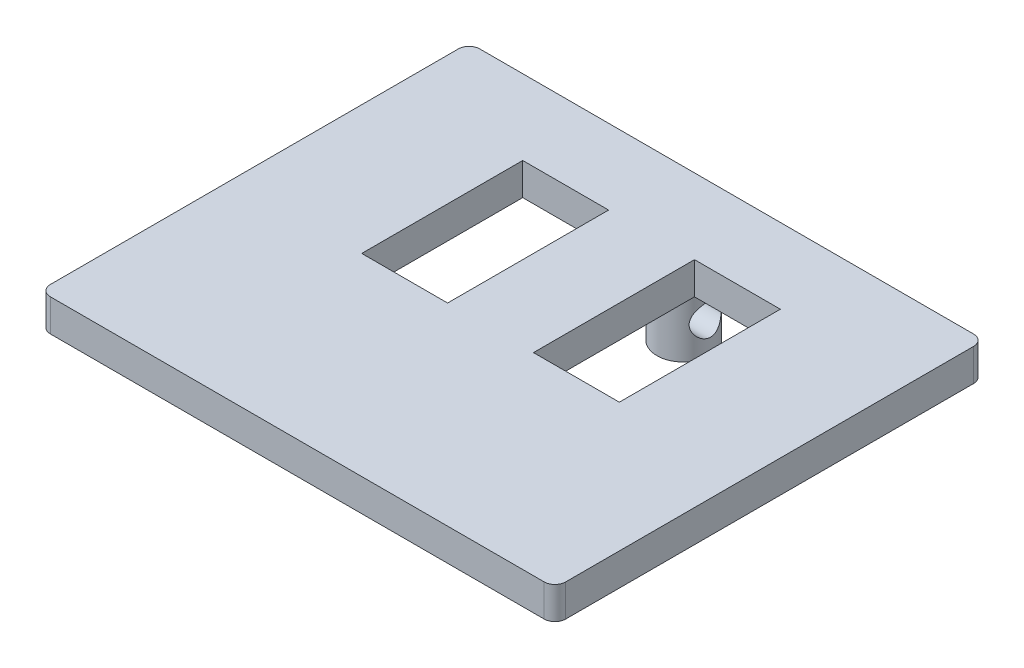
ISO-10303-21;
HEADER;
FILE_DESCRIPTION(('STEP AP214'),'2;1');
FILE_NAME('part.step','',(''),(''),'','','');
FILE_SCHEMA(('AUTOMOTIVE_DESIGN { 1 0 10303 214 1 1 1 1 }'));
ENDSEC;
DATA;
#1=APPLICATION_CONTEXT('core data for automotive mechanical design processes');
#2=APPLICATION_PROTOCOL_DEFINITION('international standard','automotive_design',2000,#1);
#3=PRODUCT_CONTEXT('',#1,'mechanical');
#4=PRODUCT('Part','Part','',(#3));
#5=PRODUCT_RELATED_PRODUCT_CATEGORY('part','',(#4));
#6=PRODUCT_DEFINITION_FORMATION('','',#4);
#7=PRODUCT_DEFINITION_CONTEXT('part definition',#1,'design');
#8=PRODUCT_DEFINITION('design','',#6,#7);
#9=PRODUCT_DEFINITION_SHAPE('','',#8);
#10=(LENGTH_UNIT() NAMED_UNIT(*) SI_UNIT(.MILLI.,.METRE.));
#11=(NAMED_UNIT(*) PLANE_ANGLE_UNIT() SI_UNIT($,.RADIAN.));
#12=(NAMED_UNIT(*) SI_UNIT($,.STERADIAN.) SOLID_ANGLE_UNIT());
#13=UNCERTAINTY_MEASURE_WITH_UNIT(LENGTH_MEASURE(1.E-05),#10,'distance_accuracy_value','');
#14=(GEOMETRIC_REPRESENTATION_CONTEXT(3) GLOBAL_UNCERTAINTY_ASSIGNED_CONTEXT((#13)) GLOBAL_UNIT_ASSIGNED_CONTEXT((#10,
#11,#12)) REPRESENTATION_CONTEXT('',''));
#15=CARTESIAN_POINT('',(0.,0.,0.));
#16=DIRECTION('',(0.,0.,1.));
#17=DIRECTION('',(1.,0.,0.));
#18=AXIS2_PLACEMENT_3D('',#15,#16,#17);
#19=CARTESIAN_POINT('',(0.,-7.,-16.));
#20=DIRECTION('',(0.,1.,0.));
#21=DIRECTION('',(0.,0.,1.));
#22=AXIS2_PLACEMENT_3D('',#19,#20,#21);
#23=CYLINDRICAL_SURFACE('',#22,2.5);
#24=CARTESIAN_POINT('',(2.,-4.,-17.5));
#25=CARTESIAN_POINT('',(1.99999416642512,-3.92452102471036,-17.5000040410859));
#26=CARTESIAN_POINT('',(2.00433633903481,-3.84906156592021,-17.4942685282401));
#27=CARTESIAN_POINT('',(2.02092590613883,-3.70067609603779,-17.4717496515279));
#28=CARTESIAN_POINT('',(2.03318155043097,-3.6277528126149,-17.4549547578894));
#29=CARTESIAN_POINT('',(2.0636233903473,-3.48691635832272,-17.4114348633579));
#30=CARTESIAN_POINT('',(2.0817666618312,-3.41897116196474,-17.3847815450315));
#31=CARTESIAN_POINT('',(2.12185904995836,-3.28856254663208,-17.3225290928302));
#32=CARTESIAN_POINT('',(2.14380930122416,-3.22610077030486,-17.2869272905469));
#33=CARTESIAN_POINT('',(2.19228594587542,-3.10005098333592,-17.2027129274764));
#34=CARTESIAN_POINT('',(2.21904371037662,-3.03725904287606,-17.1530417943529));
#35=CARTESIAN_POINT('',(2.27226229431061,-2.92023523725825,-17.0442680130998));
#36=CARTESIAN_POINT('',(2.29872287517103,-2.8660098483292,-16.9851582967296));
#37=CARTESIAN_POINT('',(2.35175567858734,-2.76186619029031,-16.8514423674117));
#38=CARTESIAN_POINT('',(2.37803133577818,-2.71304553633025,-16.7758519951625));
#39=CARTESIAN_POINT('',(2.42443786983179,-2.62919027755557,-16.6156542282717));
#40=CARTESIAN_POINT('',(2.44457437988735,-2.59414302587729,-16.5310551966263));
#41=CARTESIAN_POINT('',(2.4747098780044,-2.54240407718736,-16.3637714067427));
#42=CARTESIAN_POINT('',(2.4854930393917,-2.52427963903271,-16.2816746981309));
#43=CARTESIAN_POINT('',(2.49874939277545,-2.50205719713688,-16.1149705093827));
#44=CARTESIAN_POINT('',(2.50123038813308,-2.49794602199995,-16.0303654624002));
#45=CARTESIAN_POINT('',(2.49783372711539,-2.50361374734246,-15.8723627162627));
#46=CARTESIAN_POINT('',(2.49295437513726,-2.51173352616932,-15.7988761671344));
#47=CARTESIAN_POINT('',(2.47707997553857,-2.53847979564811,-15.6545357308482));
#48=CARTESIAN_POINT('',(2.46608447529309,-2.55710706390716,-15.5836820389488));
#49=CARTESIAN_POINT('',(2.4388490720172,-2.60416556270378,-15.4459432195309));
#50=CARTESIAN_POINT('',(2.42257910450824,-2.632653061139,-15.3790835089624));
#51=CARTESIAN_POINT('',(2.38609637638748,-2.69838461622555,-15.2510113398844));
#52=CARTESIAN_POINT('',(2.36588259201812,-2.73563094705901,-15.189800353792));
#53=CARTESIAN_POINT('',(2.32037925976363,-2.82283909280445,-15.0669257328568));
#54=CARTESIAN_POINT('',(2.2947718295215,-2.87378831173574,-15.0060813368018));
#55=CARTESIAN_POINT('',(2.24255554245601,-2.98440411786018,-14.8932853409073));
#56=CARTESIAN_POINT('',(2.21594536703376,-3.04408250347451,-14.8413459869166));
#57=CARTESIAN_POINT('',(2.16111075123946,-3.17865340616356,-14.7417516223258));
#58=CARTESIAN_POINT('',(2.13305661385125,-3.25450757653946,-14.6952906681137));
#59=CARTESIAN_POINT('',(2.08250879557268,-3.41470623163661,-14.6160278280577));
#60=CARTESIAN_POINT('',(2.06000490298821,-3.49903471612564,-14.5832007803781));
#61=CARTESIAN_POINT('',(2.02895865196732,-3.65239363189535,-14.5392250293516));
#62=CARTESIAN_POINT('',(2.01833888618316,-3.72004063229665,-14.5247209668733));
#63=CARTESIAN_POINT('',(2.00392150777559,-3.85737361029949,-14.5051912724472));
#64=CARTESIAN_POINT('',(2.00011596115117,-3.92705712048457,-14.5001546169709));
#65=CARTESIAN_POINT('',(1.99988914321324,-4.06655168243571,-14.4998521888582));
#66=CARTESIAN_POINT('',(2.00347810223985,-4.13636277721521,-14.5045999530234));
#67=CARTESIAN_POINT('',(2.01751520788653,-4.27398734374856,-14.5235970942506));
#68=CARTESIAN_POINT('',(2.02796877613214,-4.34179919224026,-14.5378539816986));
#69=CARTESIAN_POINT('',(2.05431768333101,-4.47371457947979,-14.5751168738134));
#70=CARTESIAN_POINT('',(2.07020622092813,-4.53782263653223,-14.5981119474264));
#71=CARTESIAN_POINT('',(2.10571539417588,-4.66147771573018,-14.6520373894293));
#72=CARTESIAN_POINT('',(2.12533743689999,-4.72102300636601,-14.6829707511179));
#73=CARTESIAN_POINT('',(2.17036819177737,-4.84524008251225,-14.7583256044149));
#74=CARTESIAN_POINT('',(2.1961823939737,-4.90890083509657,-14.804173369397));
#75=CARTESIAN_POINT('',(2.24821754803621,-5.02828548484946,-14.905126044813));
#76=CARTESIAN_POINT('',(2.27443886711455,-5.08400169216912,-14.960239813276));
#77=CARTESIAN_POINT('',(2.32835625910914,-5.19322400735043,-15.0867251627872));
#78=CARTESIAN_POINT('',(2.3558007587587,-5.24550072660584,-15.1592788912198));
#79=CARTESIAN_POINT('',(2.40537639133459,-5.33690277683665,-15.313896899132));
#80=CARTESIAN_POINT('',(2.42751104449411,-5.37603682784092,-15.3959548238653));
#81=CARTESIAN_POINT('',(2.46252280092775,-5.43686820343136,-15.5611597670279));
#82=CARTESIAN_POINT('',(2.47595588067329,-5.4596262277911,-15.6437940363487));
#83=CARTESIAN_POINT('',(2.494407389061,-5.49071460284625,-15.8126169361091));
#84=CARTESIAN_POINT('',(2.49943534582737,-5.49906129071762,-15.898801428218));
#85=CARTESIAN_POINT('',(2.50040600461976,-5.50067460858592,-16.059812023201));
#86=CARTESIAN_POINT('',(2.49747057186327,-5.49580333456303,-16.1346205835897));
#87=CARTESIAN_POINT('',(2.48512948412096,-5.47510617561838,-16.2821487559788));
#88=CARTESIAN_POINT('',(2.47572375706639,-5.4592801686784,-16.3548683447019));
#89=CARTESIAN_POINT('',(2.45149427526962,-5.41778042841621,-16.4951454819788));
#90=CARTESIAN_POINT('',(2.43675966858906,-5.39226840387075,-16.5627670326088));
#91=CARTESIAN_POINT('',(2.40303337447155,-5.33235940544524,-16.692781972));
#92=CARTESIAN_POINT('',(2.38404073252268,-5.29796043914039,-16.7551741841998));
#93=CARTESIAN_POINT('',(2.3409343265938,-5.21707480343124,-16.8802636452959));
#94=CARTESIAN_POINT('',(2.31648844639149,-5.16968129098313,-16.9422586904399));
#95=CARTESIAN_POINT('',(2.26601907350661,-5.06624696628227,-17.0578975153631));
#96=CARTESIAN_POINT('',(2.23999385274509,-5.01019657439209,-17.1115319095692));
#97=CARTESIAN_POINT('',(2.18528165666204,-4.8827144378223,-17.2159097535057));
#98=CARTESIAN_POINT('',(2.15667566270901,-4.8102335138345,-17.2654240666337));
#99=CARTESIAN_POINT('',(2.10376464485145,-4.65651514723345,-17.3515681721032));
#100=CARTESIAN_POINT('',(2.07945738811052,-4.57528228601858,-17.3882046632266));
#101=CARTESIAN_POINT('',(2.0408000304796,-4.41293571486279,-17.4443711653513));
#102=CARTESIAN_POINT('',(2.02577665830138,-4.33240476403875,-17.4650952606019));
#103=CARTESIAN_POINT('',(2.00539032320036,-4.16790260529632,-17.4928926824043));
#104=CARTESIAN_POINT('',(2.00000648744643,-4.08393923424129,-17.4999955059584));
#105=CARTESIAN_POINT('',(2.,-4.,-17.5));
#106=B_SPLINE_CURVE_WITH_KNOTS('',3,(#24,#25,#26,#27,#28,#29,#30,#31,#32,#33,#34,#35,#36,#37,
#38,#39,#40,#41,#42,#43,#44,#45,#46,#47,#48,#49,#50,#51,#52,#53,#54,#55,#56,#57,#58,#59,#60,#61,
#62,#63,#64,#65,#66,#67,#68,#69,#70,#71,#72,#73,#74,#75,#76,#77,#78,#79,#80,#81,#82,#83,#84,#85,
#86,#87,#88,#89,#90,#91,#92,#93,#94,#95,#96,#97,#98,#99,#100,#101,#102,#103,#104,#105),
.UNSPECIFIED.,.T.,.F.,(4,2,2,2,2,2,2,2,2,2,2,2,2,2,2,2,2,2,2,2,2,2,2,2,2,2,2,2,2,2,2,2,2,2,2,2,
2,2,2,2,4),(0.,0.226085249493391,0.452406574330769,0.677113624991873,0.90188776221593,
1.15414462390001,1.40659128601843,1.68630157736223,1.96575443271219,2.21853330858497,
2.47107452602766,2.69230130543181,2.91354445887944,3.13607155036376,3.35865648368878,
3.60782810055848,3.85733966656907,4.13576671140275,4.41367760154767,4.62276298054683,
4.83160475643975,5.0407356601118,5.25003193304127,5.45906724365494,5.6681814915466,
5.91499438482001,6.16204457978453,6.44121828011587,6.72020638384846,6.97891479383336,
7.23732973022724,7.46129321849397,7.68525920139646,7.90563970188755,8.12606965394583,
8.37042963549485,8.61506198741953,8.89071695766602,9.16622832484803,9.41820120134352,
9.66962780912275),.UNSPECIFIED.);
#107=CARTESIAN_POINT('',(2.,-4.,-17.5));
#108=VERTEX_POINT('',#107);
#109=EDGE_CURVE('E273',#108,#108,#106,.T.);
#110=ORIENTED_EDGE('',*,*,#109,.F.);
#111=EDGE_LOOP('',(#110));
#112=FACE_BOUND('',#111,.T.);
#113=CARTESIAN_POINT('',(0.,-7.,-16.));
#114=DIRECTION('',(0.,-1.,0.));
#115=DIRECTION('',(0.,0.,-1.));
#116=AXIS2_PLACEMENT_3D('',#113,#114,#115);
#117=CIRCLE('',#116,2.5);
#118=CARTESIAN_POINT('',(0.,-7.,-18.5));
#119=VERTEX_POINT('',#118);
#120=EDGE_CURVE('E180',#119,#119,#117,.T.);
#121=ORIENTED_EDGE('',*,*,#120,.F.);
#122=EDGE_LOOP('',(#121));
#123=FACE_BOUND('',#122,.T.);
#124=CARTESIAN_POINT('',(0.,0.,-16.));
#125=DIRECTION('',(0.,-1.,0.));
#126=DIRECTION('',(0.,0.,-1.));
#127=AXIS2_PLACEMENT_3D('',#124,#125,#126);
#128=CIRCLE('',#127,2.5);
#129=CARTESIAN_POINT('',(0.,0.,-18.5));
#130=VERTEX_POINT('',#129);
#131=EDGE_CURVE('E309',#130,#130,#128,.T.);
#132=ORIENTED_EDGE('',*,*,#131,.T.);
#133=EDGE_LOOP('',(#132));
#134=FACE_BOUND('',#133,.T.);
#135=CARTESIAN_POINT('',(-2.,-4.,-17.5));
#136=CARTESIAN_POINT('',(-1.99999416642512,-4.07547897528964,-17.5000040410859));
#137=CARTESIAN_POINT('',(-2.00433633903481,-4.1509384340798,-17.4942685282401));
#138=CARTESIAN_POINT('',(-2.02092590613883,-4.29932390396222,-17.4717496515279));
#139=CARTESIAN_POINT('',(-2.03318155043097,-4.3722471873851,-17.4549547578894));
#140=CARTESIAN_POINT('',(-2.0636233903473,-4.51308364167728,-17.4114348633579));
#141=CARTESIAN_POINT('',(-2.0817666618312,-4.58102883803527,-17.3847815450315));
#142=CARTESIAN_POINT('',(-2.12185904995836,-4.71143745336792,-17.3225290928302));
#143=CARTESIAN_POINT('',(-2.14380930122416,-4.77389922969514,-17.2869272905469));
#144=CARTESIAN_POINT('',(-2.19228594587542,-4.89994901666408,-17.2027129274764));
#145=CARTESIAN_POINT('',(-2.21904371037662,-4.96274095712394,-17.1530417943529));
#146=CARTESIAN_POINT('',(-2.27226229431061,-5.07976476274175,-17.0442680130998));
#147=CARTESIAN_POINT('',(-2.29872287517103,-5.1339901516708,-16.9851582967296));
#148=CARTESIAN_POINT('',(-2.35175567858734,-5.23813380970969,-16.8514423674117));
#149=CARTESIAN_POINT('',(-2.37803133577818,-5.28695446366975,-16.7758519951625));
#150=CARTESIAN_POINT('',(-2.42443786983179,-5.37080972244443,-16.6156542282717));
#151=CARTESIAN_POINT('',(-2.44457437988735,-5.40585697412271,-16.5310551966263));
#152=CARTESIAN_POINT('',(-2.4747098780044,-5.45759592281264,-16.3637714067427));
#153=CARTESIAN_POINT('',(-2.4854930393917,-5.47572036096729,-16.2816746981309));
#154=CARTESIAN_POINT('',(-2.49874939277545,-5.49794280286312,-16.1149705093827));
#155=CARTESIAN_POINT('',(-2.50123038813308,-5.50205397800005,-16.0303654624002));
#156=CARTESIAN_POINT('',(-2.49783372711539,-5.49638625265754,-15.8723627162627));
#157=CARTESIAN_POINT('',(-2.49295437513726,-5.48826647383068,-15.7988761671344));
#158=CARTESIAN_POINT('',(-2.47707997553857,-5.46152020435189,-15.6545357308482));
#159=CARTESIAN_POINT('',(-2.46608447529309,-5.44289293609284,-15.5836820389488));
#160=CARTESIAN_POINT('',(-2.4388490720172,-5.39583443729622,-15.4459432195309));
#161=CARTESIAN_POINT('',(-2.42257910450824,-5.367346938861,-15.3790835089624));
#162=CARTESIAN_POINT('',(-2.38609637638748,-5.30161538377445,-15.2510113398844));
#163=CARTESIAN_POINT('',(-2.36588259201812,-5.26436905294098,-15.189800353792));
#164=CARTESIAN_POINT('',(-2.32037925976363,-5.17716090719555,-15.0669257328568));
#165=CARTESIAN_POINT('',(-2.2947718295215,-5.12621168826426,-15.0060813368018));
#166=CARTESIAN_POINT('',(-2.24255554245601,-5.01559588213982,-14.8932853409073));
#167=CARTESIAN_POINT('',(-2.21594536703375,-4.95591749652549,-14.8413459869166));
#168=CARTESIAN_POINT('',(-2.16111075123946,-4.82134659383644,-14.7417516223258));
#169=CARTESIAN_POINT('',(-2.13305661385125,-4.74549242346054,-14.6952906681137));
#170=CARTESIAN_POINT('',(-2.08250879557268,-4.58529376836339,-14.6160278280577));
#171=CARTESIAN_POINT('',(-2.06000490298821,-4.50096528387436,-14.5832007803781));
#172=CARTESIAN_POINT('',(-2.02895865196732,-4.34760636810465,-14.5392250293516));
#173=CARTESIAN_POINT('',(-2.01833888618316,-4.27995936770335,-14.5247209668733));
#174=CARTESIAN_POINT('',(-2.00392150777559,-4.14262638970052,-14.5051912724472));
#175=CARTESIAN_POINT('',(-2.00011596115117,-4.07294287951543,-14.5001546169709));
#176=CARTESIAN_POINT('',(-1.99988914321324,-3.93344831756429,-14.4998521888582));
#177=CARTESIAN_POINT('',(-2.00347810223985,-3.86363722278479,-14.5045999530234));
#178=CARTESIAN_POINT('',(-2.01751520788653,-3.72601265625144,-14.5235970942506));
#179=CARTESIAN_POINT('',(-2.02796877613214,-3.65820080775975,-14.5378539816986));
#180=CARTESIAN_POINT('',(-2.05431768333101,-3.52628542052021,-14.5751168738134));
#181=CARTESIAN_POINT('',(-2.07020622092813,-3.46217736346777,-14.5981119474264));
#182=CARTESIAN_POINT('',(-2.10571539417587,-3.33852228426982,-14.6520373894293));
#183=CARTESIAN_POINT('',(-2.12533743689999,-3.278976993634,-14.6829707511179));
#184=CARTESIAN_POINT('',(-2.17036819177737,-3.15475991748775,-14.7583256044149));
#185=CARTESIAN_POINT('',(-2.19618239397369,-3.09109916490343,-14.804173369397));
#186=CARTESIAN_POINT('',(-2.24821754803621,-2.97171451515054,-14.905126044813));
#187=CARTESIAN_POINT('',(-2.27443886711455,-2.91599830783088,-14.960239813276));
#188=CARTESIAN_POINT('',(-2.32835625910914,-2.80677599264957,-15.0867251627872));
#189=CARTESIAN_POINT('',(-2.3558007587587,-2.75449927339416,-15.1592788912198));
#190=CARTESIAN_POINT('',(-2.40537639133459,-2.66309722316335,-15.313896899132));
#191=CARTESIAN_POINT('',(-2.42751104449411,-2.62396317215908,-15.3959548238653));
#192=CARTESIAN_POINT('',(-2.46252280092775,-2.56313179656864,-15.5611597670279));
#193=CARTESIAN_POINT('',(-2.47595588067329,-2.5403737722089,-15.6437940363487));
#194=CARTESIAN_POINT('',(-2.494407389061,-2.50928539715375,-15.8126169361091));
#195=CARTESIAN_POINT('',(-2.49943534582737,-2.50093870928238,-15.898801428218));
#196=CARTESIAN_POINT('',(-2.50040600461976,-2.49932539141408,-16.059812023201));
#197=CARTESIAN_POINT('',(-2.49747057186327,-2.50419666543697,-16.1346205835897));
#198=CARTESIAN_POINT('',(-2.48512948412096,-2.52489382438162,-16.2821487559788));
#199=CARTESIAN_POINT('',(-2.47572375706639,-2.5407198313216,-16.3548683447019));
#200=CARTESIAN_POINT('',(-2.45149427526962,-2.58221957158379,-16.4951454819788));
#201=CARTESIAN_POINT('',(-2.43675966858906,-2.60773159612925,-16.5627670326088));
#202=CARTESIAN_POINT('',(-2.40303337447155,-2.66764059455476,-16.692781972));
#203=CARTESIAN_POINT('',(-2.38404073252268,-2.7020395608596,-16.7551741841998));
#204=CARTESIAN_POINT('',(-2.34093432659381,-2.78292519656876,-16.8802636452959));
#205=CARTESIAN_POINT('',(-2.31648844639149,-2.83031870901687,-16.9422586904399));
#206=CARTESIAN_POINT('',(-2.26601907350661,-2.93375303371773,-17.0578975153631));
#207=CARTESIAN_POINT('',(-2.23999385274509,-2.98980342560791,-17.1115319095692));
#208=CARTESIAN_POINT('',(-2.18528165666204,-3.1172855621777,-17.2159097535057));
#209=CARTESIAN_POINT('',(-2.15667566270901,-3.1897664861655,-17.2654240666337));
#210=CARTESIAN_POINT('',(-2.10376464485145,-3.34348485276655,-17.3515681721032));
#211=CARTESIAN_POINT('',(-2.07945738811052,-3.42471771398142,-17.3882046632266));
#212=CARTESIAN_POINT('',(-2.0408000304796,-3.58706428513721,-17.4443711653513));
#213=CARTESIAN_POINT('',(-2.02577665830138,-3.66759523596125,-17.4650952606019));
#214=CARTESIAN_POINT('',(-2.00539032320036,-3.83209739470368,-17.4928926824043));
#215=CARTESIAN_POINT('',(-2.00000648744643,-3.91606076575871,-17.4999955059584));
#216=CARTESIAN_POINT('',(-2.,-4.,-17.5));
#217=B_SPLINE_CURVE_WITH_KNOTS('',3,(#135,#136,#137,#138,#139,#140,#141,#142,#143,#144,#145,
#146,#147,#148,#149,#150,#151,#152,#153,#154,#155,#156,#157,#158,#159,#160,#161,#162,#163,#164,
#165,#166,#167,#168,#169,#170,#171,#172,#173,#174,#175,#176,#177,#178,#179,#180,#181,#182,#183,
#184,#185,#186,#187,#188,#189,#190,#191,#192,#193,#194,#195,#196,#197,#198,#199,#200,#201,#202,
#203,#204,#205,#206,#207,#208,#209,#210,#211,#212,#213,#214,#215,#216),.UNSPECIFIED.,.T.,.F.,(4,
2,2,2,2,2,2,2,2,2,2,2,2,2,2,2,2,2,2,2,2,2,2,2,2,2,2,2,2,2,2,2,2,2,2,2,2,2,2,2,4),(0.,
0.226085249493392,0.45240657433077,0.677113624991875,0.901887762215931,1.15414462390001,
1.40659128601844,1.68630157736223,1.96575443271219,2.21853330858497,2.47107452602766,
2.69230130543181,2.91354445887944,3.13607155036376,3.35865648368878,3.60782810055848,
3.85733966656908,4.13576671140275,4.41367760154767,4.62276298054683,4.83160475643975,
5.0407356601118,5.25003193304127,5.45906724365494,5.6681814915466,5.91499438482001,
6.16204457978453,6.44121828011587,6.72020638384846,6.97891479383336,7.23732973022724,
7.46129321849397,7.68525920139647,7.90563970188754,8.12606965394582,8.37042963549485,
8.61506198741953,8.89071695766602,9.16622832484803,9.41820120134352,9.66962780912275),.UNSPECIFIED.);
#218=CARTESIAN_POINT('',(-2.,-4.,-17.5));
#219=VERTEX_POINT('',#218);
#220=EDGE_CURVE('E36',#219,#219,#217,.T.);
#221=ORIENTED_EDGE('',*,*,#220,.F.);
#222=EDGE_LOOP('',(#221));
#223=FACE_BOUND('',#222,.T.);
#224=ADVANCED_FACE('F32',(#112,#123,#134,#223),#23,.T.);
#225=CARTESIAN_POINT('',(-23.,0.,-19.));
#226=DIRECTION('',(0.,-1.,0.));
#227=DIRECTION('',(0.,0.,-1.));
#228=AXIS2_PLACEMENT_3D('',#225,#226,#227);
#229=PLANE('',#228);
#230=DIRECTION('',(1.,0.,0.));
#231=VECTOR('',#230,1.);
#232=CARTESIAN_POINT('',(12.,0.,2.));
#233=LINE('',#232,#231);
#234=CARTESIAN_POINT('',(4.,0.,2.));
#235=VERTEX_POINT('',#234);
#236=CARTESIAN_POINT('',(12.,0.,2.));
#237=VERTEX_POINT('',#236);
#238=EDGE_CURVE('E160',#235,#237,#233,.T.);
#239=ORIENTED_EDGE('',*,*,#238,.T.);
#240=DIRECTION('',(0.,0.,-1.));
#241=VECTOR('',#240,1.);
#242=CARTESIAN_POINT('',(12.,0.,2.));
#243=LINE('',#242,#241);
#244=CARTESIAN_POINT('',(12.,0.,-13.));
#245=VERTEX_POINT('',#244);
#246=EDGE_CURVE('E61',#237,#245,#243,.T.);
#247=ORIENTED_EDGE('',*,*,#246,.T.);
#248=DIRECTION('',(-1.,0.,0.));
#249=VECTOR('',#248,1.);
#250=CARTESIAN_POINT('',(12.,0.,-13.));
#251=LINE('',#250,#249);
#252=CARTESIAN_POINT('',(4.,0.,-13.));
#253=VERTEX_POINT('',#252);
#254=EDGE_CURVE('E166',#245,#253,#251,.T.);
#255=ORIENTED_EDGE('',*,*,#254,.T.);
#256=DIRECTION('',(0.,0.,1.));
#257=VECTOR('',#256,1.);
#258=CARTESIAN_POINT('',(4.,0.,-13.));
#259=LINE('',#258,#257);
#260=EDGE_CURVE('E182',#253,#235,#259,.T.);
#261=ORIENTED_EDGE('',*,*,#260,.T.);
#262=EDGE_LOOP('',(#239,#247,#255,#261));
#263=FACE_BOUND('',#262,.T.);
#264=CARTESIAN_POINT('',(-23.,0.,-19.));
#265=DIRECTION('',(0.,1.,0.));
#266=DIRECTION('',(0.,0.,-1.));
#267=AXIS2_PLACEMENT_3D('',#264,#265,#266);
#268=CIRCLE('',#267,1.);
#269=CARTESIAN_POINT('',(-23.,0.,-20.));
#270=VERTEX_POINT('',#269);
#271=CARTESIAN_POINT('',(-24.,0.,-19.));
#272=VERTEX_POINT('',#271);
#273=EDGE_CURVE('E220',#270,#272,#268,.T.);
#274=ORIENTED_EDGE('',*,*,#273,.F.);
#275=DIRECTION('',(-1.,0.,0.));
#276=VECTOR('',#275,1.);
#277=CARTESIAN_POINT('',(-23.,0.,-20.));
#278=LINE('',#277,#276);
#279=CARTESIAN_POINT('',(23.,0.,-20.));
#280=VERTEX_POINT('',#279);
#281=EDGE_CURVE('E225',#280,#270,#278,.T.);
#282=ORIENTED_EDGE('',*,*,#281,.F.);
#283=CARTESIAN_POINT('',(23.,0.,-19.));
#284=DIRECTION('',(0.,1.,0.));
#285=DIRECTION('',(0.,0.,-1.));
#286=AXIS2_PLACEMENT_3D('',#283,#284,#285);
#287=CIRCLE('',#286,1.);
#288=CARTESIAN_POINT('',(24.,0.,-19.));
#289=VERTEX_POINT('',#288);
#290=EDGE_CURVE('E252',#289,#280,#287,.T.);
#291=ORIENTED_EDGE('',*,*,#290,.F.);
#292=DIRECTION('',(0.,0.,-1.));
#293=VECTOR('',#292,1.);
#294=CARTESIAN_POINT('',(24.,0.,19.));
#295=LINE('',#294,#293);
#296=CARTESIAN_POINT('',(24.,0.,19.));
#297=VERTEX_POINT('',#296);
#298=EDGE_CURVE('E250',#297,#289,#295,.T.);
#299=ORIENTED_EDGE('',*,*,#298,.F.);
#300=CARTESIAN_POINT('',(23.,0.,19.));
#301=DIRECTION('',(0.,1.,0.));
#302=DIRECTION('',(0.,0.,-1.));
#303=AXIS2_PLACEMENT_3D('',#300,#301,#302);
#304=CIRCLE('',#303,1.);
#305=CARTESIAN_POINT('',(23.,0.,20.));
#306=VERTEX_POINT('',#305);
#307=EDGE_CURVE('E248',#306,#297,#304,.T.);
#308=ORIENTED_EDGE('',*,*,#307,.F.);
#309=DIRECTION('',(1.,0.,0.));
#310=VECTOR('',#309,1.);
#311=CARTESIAN_POINT('',(-23.,0.,20.));
#312=LINE('',#311,#310);
#313=CARTESIAN_POINT('',(-23.,0.,20.));
#314=VERTEX_POINT('',#313);
#315=EDGE_CURVE('E246',#314,#306,#312,.T.);
#316=ORIENTED_EDGE('',*,*,#315,.F.);
#317=CARTESIAN_POINT('',(-23.,0.,19.));
#318=DIRECTION('',(0.,1.,0.));
#319=DIRECTION('',(0.,0.,-1.));
#320=AXIS2_PLACEMENT_3D('',#317,#318,#319);
#321=CIRCLE('',#320,1.);
#322=CARTESIAN_POINT('',(-24.,0.,19.));
#323=VERTEX_POINT('',#322);
#324=EDGE_CURVE('E244',#323,#314,#321,.T.);
#325=ORIENTED_EDGE('',*,*,#324,.F.);
#326=DIRECTION('',(0.,0.,1.));
#327=VECTOR('',#326,1.);
#328=CARTESIAN_POINT('',(-24.,0.,19.));
#329=LINE('',#328,#327);
#330=EDGE_CURVE('E242',#272,#323,#329,.T.);
#331=ORIENTED_EDGE('',*,*,#330,.F.);
#332=EDGE_LOOP('',(#274,#282,#291,#299,#308,#316,#325,#331));
#333=FACE_BOUND('',#332,.T.);
#334=DIRECTION('',(-1.,0.,0.));
#335=VECTOR('',#334,1.);
#336=CARTESIAN_POINT('',(-4.,0.,-13.));
#337=LINE('',#336,#335);
#338=CARTESIAN_POINT('',(-4.,0.,-13.));
#339=VERTEX_POINT('',#338);
#340=CARTESIAN_POINT('',(-12.,0.,-13.));
#341=VERTEX_POINT('',#340);
#342=EDGE_CURVE('E193',#339,#341,#337,.T.);
#343=ORIENTED_EDGE('',*,*,#342,.T.);
#344=DIRECTION('',(0.,0.,1.));
#345=VECTOR('',#344,1.);
#346=CARTESIAN_POINT('',(-12.,0.,2.));
#347=LINE('',#346,#345);
#348=CARTESIAN_POINT('',(-12.,0.,2.));
#349=VERTEX_POINT('',#348);
#350=EDGE_CURVE('E167',#341,#349,#347,.T.);
#351=ORIENTED_EDGE('',*,*,#350,.T.);
#352=DIRECTION('',(1.,0.,0.));
#353=VECTOR('',#352,1.);
#354=CARTESIAN_POINT('',(-4.,0.,2.));
#355=LINE('',#354,#353);
#356=CARTESIAN_POINT('',(-4.,0.,2.));
#357=VERTEX_POINT('',#356);
#358=EDGE_CURVE('E203',#349,#357,#355,.T.);
#359=ORIENTED_EDGE('',*,*,#358,.T.);
#360=DIRECTION('',(0.,0.,-1.));
#361=VECTOR('',#360,1.);
#362=CARTESIAN_POINT('',(-4.,0.,-13.));
#363=LINE('',#362,#361);
#364=EDGE_CURVE('E206',#357,#339,#363,.T.);
#365=ORIENTED_EDGE('',*,*,#364,.T.);
#366=EDGE_LOOP('',(#343,#351,#359,#365));
#367=FACE_BOUND('',#366,.T.);
#368=ORIENTED_EDGE('',*,*,#131,.F.);
#369=EDGE_LOOP('',(#368));
#370=FACE_BOUND('',#369,.T.);
#371=ADVANCED_FACE('F295',(#263,#333,#367,#370),#229,.T.);
#372=CARTESIAN_POINT('',(-23.,3.,-19.));
#373=DIRECTION('',(0.,-1.,0.));
#374=DIRECTION('',(0.,0.,-1.));
#375=AXIS2_PLACEMENT_3D('',#372,#373,#374);
#376=PLANE('',#375);
#377=DIRECTION('',(0.,0.,1.));
#378=VECTOR('',#377,1.);
#379=CARTESIAN_POINT('',(-12.,3.,2.));
#380=LINE('',#379,#378);
#381=CARTESIAN_POINT('',(-12.,3.,-13.));
#382=VERTEX_POINT('',#381);
#383=CARTESIAN_POINT('',(-12.,3.,2.));
#384=VERTEX_POINT('',#383);
#385=EDGE_CURVE('E190',#382,#384,#380,.T.);
#386=ORIENTED_EDGE('',*,*,#385,.F.);
#387=DIRECTION('',(-1.,0.,0.));
#388=VECTOR('',#387,1.);
#389=CARTESIAN_POINT('',(-4.,3.,-13.));
#390=LINE('',#389,#388);
#391=CARTESIAN_POINT('',(-4.,3.,-13.));
#392=VERTEX_POINT('',#391);
#393=EDGE_CURVE('E198',#392,#382,#390,.T.);
#394=ORIENTED_EDGE('',*,*,#393,.F.);
#395=DIRECTION('',(0.,0.,-1.));
#396=VECTOR('',#395,1.);
#397=CARTESIAN_POINT('',(-4.,3.,-13.));
#398=LINE('',#397,#396);
#399=CARTESIAN_POINT('',(-4.,3.,2.));
#400=VERTEX_POINT('',#399);
#401=EDGE_CURVE('E195',#400,#392,#398,.T.);
#402=ORIENTED_EDGE('',*,*,#401,.F.);
#403=DIRECTION('',(1.,0.,0.));
#404=VECTOR('',#403,1.);
#405=CARTESIAN_POINT('',(-4.,3.,2.));
#406=LINE('',#405,#404);
#407=EDGE_CURVE('E192',#384,#400,#406,.T.);
#408=ORIENTED_EDGE('',*,*,#407,.F.);
#409=EDGE_LOOP('',(#386,#394,#402,#408));
#410=FACE_BOUND('',#409,.T.);
#411=CARTESIAN_POINT('',(-23.,3.,-19.));
#412=DIRECTION('',(0.,1.,0.));
#413=DIRECTION('',(0.,0.,-1.));
#414=AXIS2_PLACEMENT_3D('',#411,#412,#413);
#415=CIRCLE('',#414,1.);
#416=CARTESIAN_POINT('',(-23.,3.,-20.));
#417=VERTEX_POINT('',#416);
#418=CARTESIAN_POINT('',(-24.,3.,-19.));
#419=VERTEX_POINT('',#418);
#420=EDGE_CURVE('E221',#417,#419,#415,.T.);
#421=ORIENTED_EDGE('',*,*,#420,.T.);
#422=DIRECTION('',(0.,0.,1.));
#423=VECTOR('',#422,1.);
#424=CARTESIAN_POINT('',(-24.,3.,19.));
#425=LINE('',#424,#423);
#426=CARTESIAN_POINT('',(-24.,3.,19.));
#427=VERTEX_POINT('',#426);
#428=EDGE_CURVE('E224',#419,#427,#425,.T.);
#429=ORIENTED_EDGE('',*,*,#428,.T.);
#430=CARTESIAN_POINT('',(-23.,3.,19.));
#431=DIRECTION('',(0.,1.,0.));
#432=DIRECTION('',(0.,0.,-1.));
#433=AXIS2_PLACEMENT_3D('',#430,#431,#432);
#434=CIRCLE('',#433,1.);
#435=CARTESIAN_POINT('',(-23.,3.,20.));
#436=VERTEX_POINT('',#435);
#437=EDGE_CURVE('E227',#427,#436,#434,.T.);
#438=ORIENTED_EDGE('',*,*,#437,.T.);
#439=DIRECTION('',(1.,0.,0.));
#440=VECTOR('',#439,1.);
#441=CARTESIAN_POINT('',(-23.,3.,20.));
#442=LINE('',#441,#440);
#443=CARTESIAN_POINT('',(23.,3.,20.));
#444=VERTEX_POINT('',#443);
#445=EDGE_CURVE('E229',#436,#444,#442,.T.);
#446=ORIENTED_EDGE('',*,*,#445,.T.);
#447=CARTESIAN_POINT('',(23.,3.,19.));
#448=DIRECTION('',(0.,1.,0.));
#449=DIRECTION('',(0.,0.,-1.));
#450=AXIS2_PLACEMENT_3D('',#447,#448,#449);
#451=CIRCLE('',#450,1.);
#452=CARTESIAN_POINT('',(24.,3.,19.));
#453=VERTEX_POINT('',#452);
#454=EDGE_CURVE('E231',#444,#453,#451,.T.);
#455=ORIENTED_EDGE('',*,*,#454,.T.);
#456=DIRECTION('',(0.,0.,-1.));
#457=VECTOR('',#456,1.);
#458=CARTESIAN_POINT('',(24.,3.,19.));
#459=LINE('',#458,#457);
#460=CARTESIAN_POINT('',(24.,3.,-19.));
#461=VERTEX_POINT('',#460);
#462=EDGE_CURVE('E233',#453,#461,#459,.T.);
#463=ORIENTED_EDGE('',*,*,#462,.T.);
#464=CARTESIAN_POINT('',(23.,3.,-19.));
#465=DIRECTION('',(0.,1.,0.));
#466=DIRECTION('',(0.,0.,-1.));
#467=AXIS2_PLACEMENT_3D('',#464,#465,#466);
#468=CIRCLE('',#467,1.);
#469=CARTESIAN_POINT('',(23.,3.,-20.));
#470=VERTEX_POINT('',#469);
#471=EDGE_CURVE('E235',#461,#470,#468,.T.);
#472=ORIENTED_EDGE('',*,*,#471,.T.);
#473=DIRECTION('',(-1.,0.,0.));
#474=VECTOR('',#473,1.);
#475=CARTESIAN_POINT('',(-23.,3.,-20.));
#476=LINE('',#475,#474);
#477=EDGE_CURVE('E237',#470,#417,#476,.T.);
#478=ORIENTED_EDGE('',*,*,#477,.T.);
#479=EDGE_LOOP('',(#421,#429,#438,#446,#455,#463,#472,#478));
#480=FACE_BOUND('',#479,.T.);
#481=DIRECTION('',(0.,0.,-1.));
#482=VECTOR('',#481,1.);
#483=CARTESIAN_POINT('',(12.,3.,2.));
#484=LINE('',#483,#482);
#485=CARTESIAN_POINT('',(12.,3.,2.));
#486=VERTEX_POINT('',#485);
#487=CARTESIAN_POINT('',(12.,3.,-13.));
#488=VERTEX_POINT('',#487);
#489=EDGE_CURVE('E151',#486,#488,#484,.T.);
#490=ORIENTED_EDGE('',*,*,#489,.F.);
#491=DIRECTION('',(1.,0.,0.));
#492=VECTOR('',#491,1.);
#493=CARTESIAN_POINT('',(12.,3.,2.));
#494=LINE('',#493,#492);
#495=CARTESIAN_POINT('',(4.,3.,2.00000000000001));
#496=VERTEX_POINT('',#495);
#497=EDGE_CURVE('E174',#496,#486,#494,.T.);
#498=ORIENTED_EDGE('',*,*,#497,.F.);
#499=DIRECTION('',(0.,0.,1.));
#500=VECTOR('',#499,1.);
#501=CARTESIAN_POINT('',(4.,3.,-13.));
#502=LINE('',#501,#500);
#503=CARTESIAN_POINT('',(4.,3.,-13.));
#504=VERTEX_POINT('',#503);
#505=EDGE_CURVE('E172',#504,#496,#502,.T.);
#506=ORIENTED_EDGE('',*,*,#505,.F.);
#507=DIRECTION('',(-1.,0.,0.));
#508=VECTOR('',#507,1.);
#509=CARTESIAN_POINT('',(12.,3.,-13.));
#510=LINE('',#509,#508);
#511=EDGE_CURVE('E159',#488,#504,#510,.T.);
#512=ORIENTED_EDGE('',*,*,#511,.F.);
#513=EDGE_LOOP('',(#490,#498,#506,#512));
#514=FACE_BOUND('',#513,.T.);
#515=ADVANCED_FACE('F171',(#410,#480,#514),#376,.F.);
#516=CARTESIAN_POINT('',(-23.,3.,-19.));
#517=DIRECTION('',(0.,-1.,0.));
#518=DIRECTION('',(0.,0.,-1.));
#519=AXIS2_PLACEMENT_3D('',#516,#517,#518);
#520=CYLINDRICAL_SURFACE('',#519,1.);
#521=ORIENTED_EDGE('',*,*,#273,.T.);
#522=DIRECTION('',(0.,-1.,0.));
#523=VECTOR('',#522,1.);
#524=CARTESIAN_POINT('',(-24.,3.,-19.));
#525=LINE('',#524,#523);
#526=EDGE_CURVE('E12',#419,#272,#525,.T.);
#527=ORIENTED_EDGE('',*,*,#526,.F.);
#528=ORIENTED_EDGE('',*,*,#420,.F.);
#529=DIRECTION('',(0.,-1.,0.));
#530=VECTOR('',#529,1.);
#531=CARTESIAN_POINT('',(-23.,3.,-20.));
#532=LINE('',#531,#530);
#533=EDGE_CURVE('E239',#417,#270,#532,.T.);
#534=ORIENTED_EDGE('',*,*,#533,.T.);
#535=EDGE_LOOP('',(#521,#527,#528,#534));
#536=FACE_BOUND('',#535,.T.);
#537=ADVANCED_FACE('F34',(#536),#520,.T.);
#538=CARTESIAN_POINT('',(-24.,3.,19.));
#539=DIRECTION('',(1.,0.,0.));
#540=DIRECTION('',(0.,0.,-1.));
#541=AXIS2_PLACEMENT_3D('',#538,#539,#540);
#542=PLANE('',#541);
#543=ORIENTED_EDGE('',*,*,#330,.T.);
#544=DIRECTION('',(0.,-1.,0.));
#545=VECTOR('',#544,1.);
#546=CARTESIAN_POINT('',(-24.,3.,19.));
#547=LINE('',#546,#545);
#548=EDGE_CURVE('E45',#427,#323,#547,.T.);
#549=ORIENTED_EDGE('',*,*,#548,.F.);
#550=ORIENTED_EDGE('',*,*,#428,.F.);
#551=ORIENTED_EDGE('',*,*,#526,.T.);
#552=EDGE_LOOP('',(#543,#549,#550,#551));
#553=FACE_BOUND('',#552,.T.);
#554=ADVANCED_FACE('F346',(#553),#542,.F.);
#555=CARTESIAN_POINT('',(-23.,3.,19.));
#556=DIRECTION('',(0.,-1.,0.));
#557=DIRECTION('',(0.,0.,-1.));
#558=AXIS2_PLACEMENT_3D('',#555,#556,#557);
#559=CYLINDRICAL_SURFACE('',#558,1.);
#560=ORIENTED_EDGE('',*,*,#324,.T.);
#561=DIRECTION('',(0.,-1.,0.));
#562=VECTOR('',#561,1.);
#563=CARTESIAN_POINT('',(-23.,3.,20.));
#564=LINE('',#563,#562);
#565=EDGE_CURVE('E269',#436,#314,#564,.T.);
#566=ORIENTED_EDGE('',*,*,#565,.F.);
#567=ORIENTED_EDGE('',*,*,#437,.F.);
#568=ORIENTED_EDGE('',*,*,#548,.T.);
#569=EDGE_LOOP('',(#560,#566,#567,#568));
#570=FACE_BOUND('',#569,.T.);
#571=ADVANCED_FACE('F343',(#570),#559,.T.);
#572=CARTESIAN_POINT('',(-23.,3.,20.));
#573=DIRECTION('',(0.,0.,-1.));
#574=DIRECTION('',(-1.,0.,0.));
#575=AXIS2_PLACEMENT_3D('',#572,#573,#574);
#576=PLANE('',#575);
#577=ORIENTED_EDGE('',*,*,#315,.T.);
#578=DIRECTION('',(0.,-1.,0.));
#579=VECTOR('',#578,1.);
#580=CARTESIAN_POINT('',(23.,3.,20.));
#581=LINE('',#580,#579);
#582=EDGE_CURVE('E266',#444,#306,#581,.T.);
#583=ORIENTED_EDGE('',*,*,#582,.F.);
#584=ORIENTED_EDGE('',*,*,#445,.F.);
#585=ORIENTED_EDGE('',*,*,#565,.T.);
#586=EDGE_LOOP('',(#577,#583,#584,#585));
#587=FACE_BOUND('',#586,.T.);
#588=ADVANCED_FACE('F339',(#587),#576,.F.);
#589=CARTESIAN_POINT('',(23.,3.,19.));
#590=DIRECTION('',(0.,-1.,0.));
#591=DIRECTION('',(0.,0.,-1.));
#592=AXIS2_PLACEMENT_3D('',#589,#590,#591);
#593=CYLINDRICAL_SURFACE('',#592,1.);
#594=ORIENTED_EDGE('',*,*,#307,.T.);
#595=DIRECTION('',(0.,-1.,0.));
#596=VECTOR('',#595,1.);
#597=CARTESIAN_POINT('',(24.,3.,19.));
#598=LINE('',#597,#596);
#599=EDGE_CURVE('E263',#453,#297,#598,.T.);
#600=ORIENTED_EDGE('',*,*,#599,.F.);
#601=ORIENTED_EDGE('',*,*,#454,.F.);
#602=ORIENTED_EDGE('',*,*,#582,.T.);
#603=EDGE_LOOP('',(#594,#600,#601,#602));
#604=FACE_BOUND('',#603,.T.);
#605=ADVANCED_FACE('F335',(#604),#593,.T.);
#606=CARTESIAN_POINT('',(24.,3.,19.));
#607=DIRECTION('',(-1.,0.,0.));
#608=DIRECTION('',(0.,0.,1.));
#609=AXIS2_PLACEMENT_3D('',#606,#607,#608);
#610=PLANE('',#609);
#611=ORIENTED_EDGE('',*,*,#298,.T.);
#612=DIRECTION('',(0.,-1.,0.));
#613=VECTOR('',#612,1.);
#614=CARTESIAN_POINT('',(24.,3.,-19.));
#615=LINE('',#614,#613);
#616=EDGE_CURVE('E260',#461,#289,#615,.T.);
#617=ORIENTED_EDGE('',*,*,#616,.F.);
#618=ORIENTED_EDGE('',*,*,#462,.F.);
#619=ORIENTED_EDGE('',*,*,#599,.T.);
#620=EDGE_LOOP('',(#611,#617,#618,#619));
#621=FACE_BOUND('',#620,.T.);
#622=ADVANCED_FACE('F331',(#621),#610,.F.);
#623=CARTESIAN_POINT('',(23.,3.,-19.));
#624=DIRECTION('',(0.,-1.,0.));
#625=DIRECTION('',(0.,0.,-1.));
#626=AXIS2_PLACEMENT_3D('',#623,#624,#625);
#627=CYLINDRICAL_SURFACE('',#626,1.);
#628=ORIENTED_EDGE('',*,*,#290,.T.);
#629=DIRECTION('',(0.,-1.,0.));
#630=VECTOR('',#629,1.);
#631=CARTESIAN_POINT('',(23.,3.,-20.));
#632=LINE('',#631,#630);
#633=EDGE_CURVE('E257',#470,#280,#632,.T.);
#634=ORIENTED_EDGE('',*,*,#633,.F.);
#635=ORIENTED_EDGE('',*,*,#471,.F.);
#636=ORIENTED_EDGE('',*,*,#616,.T.);
#637=EDGE_LOOP('',(#628,#634,#635,#636));
#638=FACE_BOUND('',#637,.T.);
#639=ADVANCED_FACE('F327',(#638),#627,.T.);
#640=CARTESIAN_POINT('',(-23.,3.,-20.));
#641=DIRECTION('',(0.,0.,1.));
#642=DIRECTION('',(1.,0.,0.));
#643=AXIS2_PLACEMENT_3D('',#640,#641,#642);
#644=PLANE('',#643);
#645=ORIENTED_EDGE('',*,*,#281,.T.);
#646=ORIENTED_EDGE('',*,*,#533,.F.);
#647=ORIENTED_EDGE('',*,*,#477,.F.);
#648=ORIENTED_EDGE('',*,*,#633,.T.);
#649=EDGE_LOOP('',(#645,#646,#647,#648));
#650=FACE_BOUND('',#649,.T.);
#651=ADVANCED_FACE('F323',(#650),#644,.F.);
#652=CARTESIAN_POINT('',(-12.,3.,2.));
#653=DIRECTION('',(1.,0.,0.));
#654=DIRECTION('',(0.,0.,-1.));
#655=AXIS2_PLACEMENT_3D('',#652,#653,#654);
#656=PLANE('',#655);
#657=ORIENTED_EDGE('',*,*,#350,.F.);
#658=DIRECTION('',(0.,-1.,0.));
#659=VECTOR('',#658,1.);
#660=CARTESIAN_POINT('',(-12.,3.,-13.));
#661=LINE('',#660,#659);
#662=EDGE_CURVE('E200',#382,#341,#661,.T.);
#663=ORIENTED_EDGE('',*,*,#662,.F.);
#664=ORIENTED_EDGE('',*,*,#385,.T.);
#665=DIRECTION('',(0.,-1.,0.));
#666=VECTOR('',#665,1.);
#667=CARTESIAN_POINT('',(-12.,3.,2.));
#668=LINE('',#667,#666);
#669=EDGE_CURVE('E217',#384,#349,#668,.T.);
#670=ORIENTED_EDGE('',*,*,#669,.T.);
#671=EDGE_LOOP('',(#657,#663,#664,#670));
#672=FACE_BOUND('',#671,.T.);
#673=ADVANCED_FACE('F326',(#672),#656,.T.);
#674=CARTESIAN_POINT('',(-4.,3.,2.));
#675=DIRECTION('',(0.,0.,-1.));
#676=DIRECTION('',(-1.,0.,0.));
#677=AXIS2_PLACEMENT_3D('',#674,#675,#676);
#678=PLANE('',#677);
#679=ORIENTED_EDGE('',*,*,#358,.F.);
#680=ORIENTED_EDGE('',*,*,#669,.F.);
#681=ORIENTED_EDGE('',*,*,#407,.T.);
#682=DIRECTION('',(0.,-1.,0.));
#683=VECTOR('',#682,1.);
#684=CARTESIAN_POINT('',(-4.,3.,2.));
#685=LINE('',#684,#683);
#686=EDGE_CURVE('E215',#400,#357,#685,.T.);
#687=ORIENTED_EDGE('',*,*,#686,.T.);
#688=EDGE_LOOP('',(#679,#680,#681,#687));
#689=FACE_BOUND('',#688,.T.);
#690=ADVANCED_FACE('F391',(#689),#678,.T.);
#691=CARTESIAN_POINT('',(-4.,3.,-13.));
#692=DIRECTION('',(-1.,0.,0.));
#693=DIRECTION('',(0.,0.,1.));
#694=AXIS2_PLACEMENT_3D('',#691,#692,#693);
#695=PLANE('',#694);
#696=ORIENTED_EDGE('',*,*,#364,.F.);
#697=ORIENTED_EDGE('',*,*,#686,.F.);
#698=ORIENTED_EDGE('',*,*,#401,.T.);
#699=DIRECTION('',(0.,-1.,0.));
#700=VECTOR('',#699,1.);
#701=CARTESIAN_POINT('',(-4.,3.,-13.));
#702=LINE('',#701,#700);
#703=EDGE_CURVE('E213',#392,#339,#702,.T.);
#704=ORIENTED_EDGE('',*,*,#703,.T.);
#705=EDGE_LOOP('',(#696,#697,#698,#704));
#706=FACE_BOUND('',#705,.T.);
#707=ADVANCED_FACE('F393',(#706),#695,.T.);
#708=CARTESIAN_POINT('',(-4.,3.,-13.));
#709=DIRECTION('',(0.,0.,1.));
#710=DIRECTION('',(1.,0.,0.));
#711=AXIS2_PLACEMENT_3D('',#708,#709,#710);
#712=PLANE('',#711);
#713=ORIENTED_EDGE('',*,*,#342,.F.);
#714=ORIENTED_EDGE('',*,*,#703,.F.);
#715=ORIENTED_EDGE('',*,*,#393,.T.);
#716=ORIENTED_EDGE('',*,*,#662,.T.);
#717=EDGE_LOOP('',(#713,#714,#715,#716));
#718=FACE_BOUND('',#717,.T.);
#719=ADVANCED_FACE('F381',(#718),#712,.T.);
#720=CARTESIAN_POINT('',(12.,3.,2.));
#721=DIRECTION('',(-1.,0.,0.));
#722=DIRECTION('',(0.,0.,1.));
#723=AXIS2_PLACEMENT_3D('',#720,#721,#722);
#724=PLANE('',#723);
#725=ORIENTED_EDGE('',*,*,#246,.F.);
#726=DIRECTION('',(0.,-1.,0.));
#727=VECTOR('',#726,1.);
#728=CARTESIAN_POINT('',(12.,3.,2.));
#729=LINE('',#728,#727);
#730=EDGE_CURVE('E155',#486,#237,#729,.T.);
#731=ORIENTED_EDGE('',*,*,#730,.F.);
#732=ORIENTED_EDGE('',*,*,#489,.T.);
#733=DIRECTION('',(0.,-1.,0.));
#734=VECTOR('',#733,1.);
#735=CARTESIAN_POINT('',(12.,3.,-13.));
#736=LINE('',#735,#734);
#737=EDGE_CURVE('E154',#488,#245,#736,.T.);
#738=ORIENTED_EDGE('',*,*,#737,.T.);
#739=EDGE_LOOP('',(#725,#731,#732,#738));
#740=FACE_BOUND('',#739,.T.);
#741=ADVANCED_FACE('F153',(#740),#724,.T.);
#742=CARTESIAN_POINT('',(12.,3.,-13.));
#743=DIRECTION('',(0.,0.,1.));
#744=DIRECTION('',(1.,0.,0.));
#745=AXIS2_PLACEMENT_3D('',#742,#743,#744);
#746=PLANE('',#745);
#747=ORIENTED_EDGE('',*,*,#254,.F.);
#748=ORIENTED_EDGE('',*,*,#737,.F.);
#749=ORIENTED_EDGE('',*,*,#511,.T.);
#750=DIRECTION('',(0.,-1.,0.));
#751=VECTOR('',#750,1.);
#752=CARTESIAN_POINT('',(4.,3.,-13.));
#753=LINE('',#752,#751);
#754=EDGE_CURVE('E168',#504,#253,#753,.T.);
#755=ORIENTED_EDGE('',*,*,#754,.T.);
#756=EDGE_LOOP('',(#747,#748,#749,#755));
#757=FACE_BOUND('',#756,.T.);
#758=ADVANCED_FACE('F163',(#757),#746,.T.);
#759=CARTESIAN_POINT('',(4.,3.,-13.));
#760=DIRECTION('',(1.,0.,0.));
#761=DIRECTION('',(0.,0.,-1.));
#762=AXIS2_PLACEMENT_3D('',#759,#760,#761);
#763=PLANE('',#762);
#764=ORIENTED_EDGE('',*,*,#260,.F.);
#765=ORIENTED_EDGE('',*,*,#754,.F.);
#766=ORIENTED_EDGE('',*,*,#505,.T.);
#767=DIRECTION('',(0.,-1.,0.));
#768=VECTOR('',#767,1.);
#769=CARTESIAN_POINT('',(4.,3.,2.));
#770=LINE('',#769,#768);
#771=EDGE_CURVE('E53',#496,#235,#770,.T.);
#772=ORIENTED_EDGE('',*,*,#771,.T.);
#773=EDGE_LOOP('',(#764,#765,#766,#772));
#774=FACE_BOUND('',#773,.T.);
#775=ADVANCED_FACE('F292',(#774),#763,.T.);
#776=CARTESIAN_POINT('',(12.,3.,2.));
#777=DIRECTION('',(0.,0.,-1.));
#778=DIRECTION('',(-1.,0.,0.));
#779=AXIS2_PLACEMENT_3D('',#776,#777,#778);
#780=PLANE('',#779);
#781=ORIENTED_EDGE('',*,*,#238,.F.);
#782=ORIENTED_EDGE('',*,*,#771,.F.);
#783=ORIENTED_EDGE('',*,*,#497,.T.);
#784=ORIENTED_EDGE('',*,*,#730,.T.);
#785=EDGE_LOOP('',(#781,#782,#783,#784));
#786=FACE_BOUND('',#785,.T.);
#787=ADVANCED_FACE('F287',(#786),#780,.T.);
#788=CARTESIAN_POINT('',(0.,-7.,-16.));
#789=DIRECTION('',(0.,-1.,0.));
#790=DIRECTION('',(0.,0.,-1.));
#791=AXIS2_PLACEMENT_3D('',#788,#789,#790);
#792=PLANE('',#791);
#793=ORIENTED_EDGE('',*,*,#120,.T.);
#794=EDGE_LOOP('',(#793));
#795=FACE_BOUND('',#794,.T.);
#796=ADVANCED_FACE('F283',(#795),#792,.T.);
#797=CARTESIAN_POINT('',(-8.,-4.,-16.));
#798=DIRECTION('',(1.,0.,0.));
#799=DIRECTION('',(0.,0.,-1.));
#800=AXIS2_PLACEMENT_3D('',#797,#798,#799);
#801=CYLINDRICAL_SURFACE('',#800,1.5);
#802=ORIENTED_EDGE('',*,*,#109,.T.);
#803=EDGE_LOOP('',(#802));
#804=FACE_BOUND('',#803,.T.);
#805=ORIENTED_EDGE('',*,*,#220,.T.);
#806=EDGE_LOOP('',(#805));
#807=FACE_BOUND('',#806,.T.);
#808=ADVANCED_FACE('F280',(#804,#807),#801,.F.);
#809=CLOSED_SHELL('',(#224,#371,#515,#537,#554,#571,#588,#605,#622,#639,#651,#673,#690,#707,
#719,#741,#758,#775,#787,#796,#808));
#810=MANIFOLD_SOLID_BREP('B2',#809);
#811=ADVANCED_BREP_SHAPE_REPRESENTATION('',(#18,#810),#14);
#812=SHAPE_DEFINITION_REPRESENTATION(#9,#811);
ENDSEC;
END-ISO-10303-21;
